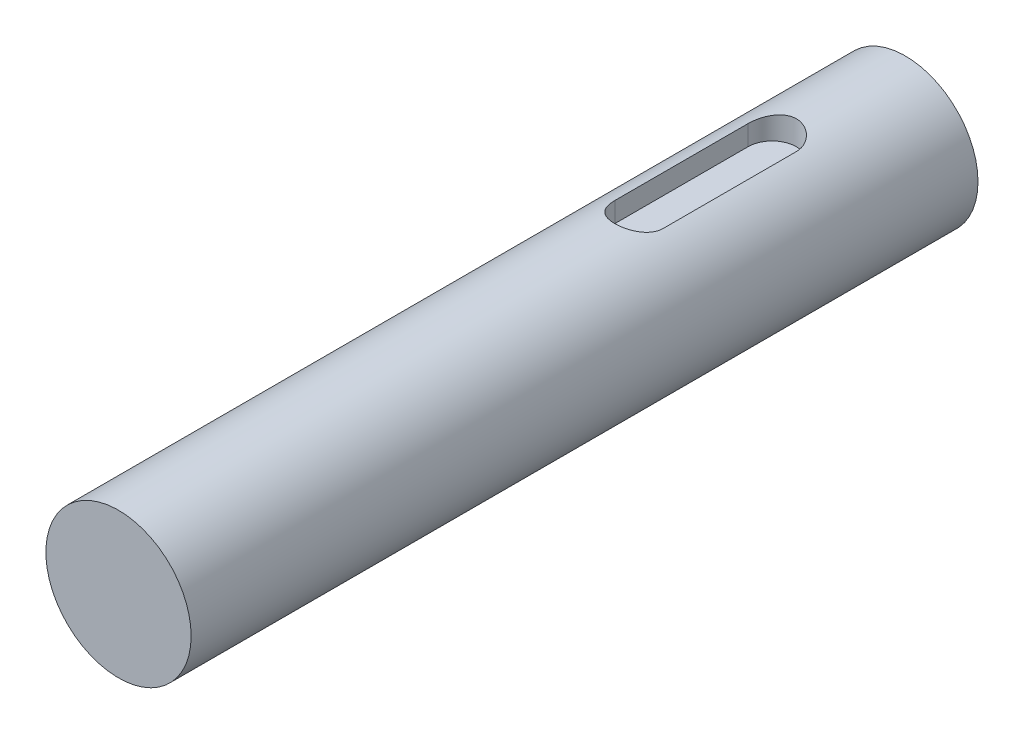
ISO-10303-21;
HEADER;
FILE_DESCRIPTION(('STEP AP214'),'2;1');
FILE_NAME('part.step','',(''),(''),'','','');
FILE_SCHEMA(('AUTOMOTIVE_DESIGN { 1 0 10303 214 1 1 1 1 }'));
ENDSEC;
DATA;
#1=APPLICATION_CONTEXT('core data for automotive mechanical design processes');
#2=APPLICATION_PROTOCOL_DEFINITION('international standard','automotive_design',2000,#1);
#3=PRODUCT_CONTEXT('',#1,'mechanical');
#4=PRODUCT('Part','Part','',(#3));
#5=PRODUCT_RELATED_PRODUCT_CATEGORY('part','',(#4));
#6=PRODUCT_DEFINITION_FORMATION('','',#4);
#7=PRODUCT_DEFINITION_CONTEXT('part definition',#1,'design');
#8=PRODUCT_DEFINITION('design','',#6,#7);
#9=PRODUCT_DEFINITION_SHAPE('','',#8);
#10=(LENGTH_UNIT() NAMED_UNIT(*) SI_UNIT(.MILLI.,.METRE.));
#11=(NAMED_UNIT(*) PLANE_ANGLE_UNIT() SI_UNIT($,.RADIAN.));
#12=(NAMED_UNIT(*) SI_UNIT($,.STERADIAN.) SOLID_ANGLE_UNIT());
#13=UNCERTAINTY_MEASURE_WITH_UNIT(LENGTH_MEASURE(1.E-05),#10,'distance_accuracy_value','');
#14=(GEOMETRIC_REPRESENTATION_CONTEXT(3) GLOBAL_UNCERTAINTY_ASSIGNED_CONTEXT((#13)) GLOBAL_UNIT_ASSIGNED_CONTEXT((#10,
#11,#12)) REPRESENTATION_CONTEXT('',''));
#15=CARTESIAN_POINT('',(0.,0.,0.));
#16=DIRECTION('',(0.,0.,1.));
#17=DIRECTION('',(1.,0.,0.));
#18=AXIS2_PLACEMENT_3D('',#15,#16,#17);
#19=CARTESIAN_POINT('',(0.,0.,-50.));
#20=DIRECTION('',(0.,0.,1.));
#21=DIRECTION('',(1.,0.,0.));
#22=AXIS2_PLACEMENT_3D('',#19,#20,#21);
#23=CYLINDRICAL_SURFACE('',#22,6.);
#24=CARTESIAN_POINT('',(-2.,5.65685424949238,-28.));
#25=CARTESIAN_POINT('',(-2.0000014949184,5.65684884188678,-27.9454190063978));
#26=CARTESIAN_POINT('',(-1.99776424917479,5.6576451988649,-27.8908658756213));
#27=CARTESIAN_POINT('',(-1.9888512140728,5.66078654578442,-27.7821828318902));
#28=CARTESIAN_POINT('',(-1.98217662286705,5.66313111768244,-27.7280528086806));
#29=CARTESIAN_POINT('',(-1.95562135046158,5.67238184449301,-27.5672157136097));
#30=CARTESIAN_POINT('',(-1.92920846605623,5.6815058499903,-27.461638307459));
#31=CARTESIAN_POINT('',(-1.85991682366086,5.70456149397718,-27.2567496151124));
#32=CARTESIAN_POINT('',(-1.81704715197507,5.71849047905858,-27.1574349062542));
#33=CARTESIAN_POINT('',(-1.71614645792974,5.74957574438921,-26.9673203319891));
#34=CARTESIAN_POINT('',(-1.65810612564547,5.76673400456216,-26.8765257418653));
#35=CARTESIAN_POINT('',(-1.52610278704603,5.80308960804095,-26.7025595373509));
#36=CARTESIAN_POINT('',(-1.45164996064407,5.82233755536618,-26.6197702390748));
#37=CARTESIAN_POINT('',(-1.28997688598297,5.86027697385955,-26.4675879644166));
#38=CARTESIAN_POINT('',(-1.20275436910907,5.87896834543705,-26.3981973734881));
#39=CARTESIAN_POINT('',(-1.01520729191253,5.91427765988454,-26.2730409623916));
#40=CARTESIAN_POINT('',(-0.914600178716995,5.93082875123708,-26.2176780311955));
#41=CARTESIAN_POINT('',(-0.704858499931719,5.95939217209316,-26.1248154966255));
#42=CARTESIAN_POINT('',(-0.595726551186841,5.97140588786619,-26.0873104363591));
#43=CARTESIAN_POINT('',(-0.376058690956075,5.98918142285845,-26.0325285478173));
#44=CARTESIAN_POINT('',(-0.265703668920225,5.99514617977147,-26.0145934548926));
#45=CARTESIAN_POINT('',(-0.0433979389113468,6.00087216807633,-25.9973674029488));
#46=CARTESIAN_POINT('',(0.0685523824907837,6.00063487762605,-25.9980720014605));
#47=CARTESIAN_POINT('',(0.286207690558783,5.99412077270532,-26.0176885662133));
#48=CARTESIAN_POINT('',(0.391985405251071,5.98808121982527,-26.0358852759189));
#49=CARTESIAN_POINT('',(0.598888128753311,5.97093921001647,-26.0887863973482));
#50=CARTESIAN_POINT('',(0.700012879232928,5.95983647235462,-26.1234917244125));
#51=CARTESIAN_POINT('',(0.896305246061924,5.93351336542608,-26.2088427392013));
#52=CARTESIAN_POINT('',(0.991377011307984,5.91824075676625,-26.2596920902447));
#53=CARTESIAN_POINT('',(1.17184917819498,5.88516775360088,-26.3757199027814));
#54=CARTESIAN_POINT('',(1.25724693942937,5.86736667195186,-26.440902262093));
#55=CARTESIAN_POINT('',(1.42019467942243,5.83012543885479,-26.5873420999937));
#56=CARTESIAN_POINT('',(1.4971872232254,5.81064757359828,-26.6692110872194));
#57=CARTESIAN_POINT('',(1.63654404964077,5.77294980945702,-26.8448829794323));
#58=CARTESIAN_POINT('',(1.69890360636763,5.75473031831506,-26.9386897248065));
#59=CARTESIAN_POINT('',(1.80800665118557,5.72140062752635,-27.1373603567066));
#60=CARTESIAN_POINT('',(1.85450601901537,5.70634029896469,-27.2423670298659));
#61=CARTESIAN_POINT('',(1.92892046140223,5.68162194124078,-27.4592939551799));
#62=CARTESIAN_POINT('',(1.95686487211071,5.67195538817985,-27.5712029867443));
#63=CARTESIAN_POINT('',(1.98331631256166,5.6627308418944,-27.736837273496));
#64=CARTESIAN_POINT('',(1.98957012251023,5.66053335389204,-27.7892827797085));
#65=CARTESIAN_POINT('',(1.99790923214239,5.65759407142798,-27.8944761567996));
#66=CARTESIAN_POINT('',(1.99999991078996,5.65685039859056,-27.9472235490888));
#67=CARTESIAN_POINT('',(2.,5.65685424949238,-28.));
#68=B_SPLINE_CURVE_WITH_KNOTS('',3,(#24,#25,#26,#27,#28,#29,#30,#31,#32,#33,#34,#35,#36,#37,#38,
#39,#40,#41,#42,#43,#44,#45,#46,#47,#48,#49,#50,#51,#52,#53,#54,#55,#56,#57,#58,#59,#60,#61,#62,
#63,#64,#65,#66,#67),.UNSPECIFIED.,.F.,.F.,(4,2,2,2,2,2,2,2,2,2,2,2,2,2,2,2,2,2,2,2,2,4),(0.,
0.163636969470864,0.327229772338922,0.653162396790745,0.978915321932474,1.30486862627062,
1.64233009925355,1.97985159727495,2.32618265866202,2.67240782242255,3.00658941454806,
3.34069136061285,3.6616883693147,3.98270317816496,4.30794037651935,4.63326613177537,
4.973881081161,5.31460588498485,5.6603605985608,6.00556734973678,6.16399790665503,
6.32222363058113),.UNSPECIFIED.);
#69=CARTESIAN_POINT('',(-2.,5.65685424949238,-28.));
#70=VERTEX_POINT('',#69);
#71=CARTESIAN_POINT('',(2.,5.65685424949238,-28.));
#72=VERTEX_POINT('',#71);
#73=EDGE_CURVE('E111',#70,#72,#68,.T.);
#74=ORIENTED_EDGE('',*,*,#73,.F.);
#75=DIRECTION('',(0.,0.,1.));
#76=VECTOR('',#75,1.);
#77=CARTESIAN_POINT('',(-2.,5.65685424949238,-50.));
#78=LINE('',#77,#76);
#79=CARTESIAN_POINT('',(-2.,5.65685424949238,-39.));
#80=VERTEX_POINT('',#79);
#81=EDGE_CURVE('E11',#80,#70,#78,.T.);
#82=ORIENTED_EDGE('',*,*,#81,.F.);
#83=CARTESIAN_POINT('',(2.,5.65685424949238,-39.));
#84=CARTESIAN_POINT('',(2.0000014949184,5.65684884188678,-39.0545809936022));
#85=CARTESIAN_POINT('',(1.99776424917478,5.6576451988649,-39.1091341243786));
#86=CARTESIAN_POINT('',(1.9888512140728,5.66078654578442,-39.2178171681098));
#87=CARTESIAN_POINT('',(1.98217662286705,5.66313111768244,-39.2719471913194));
#88=CARTESIAN_POINT('',(1.95562135046157,5.67238184449301,-39.4327842863903));
#89=CARTESIAN_POINT('',(1.92920846605622,5.6815058499903,-39.538361692541));
#90=CARTESIAN_POINT('',(1.85991682366085,5.70456149397718,-39.7432503848876));
#91=CARTESIAN_POINT('',(1.81704715197506,5.71849047905858,-39.8425650937458));
#92=CARTESIAN_POINT('',(1.71614645792973,5.74957574438921,-40.0326796680109));
#93=CARTESIAN_POINT('',(1.65810612564547,5.76673400456216,-40.1234742581347));
#94=CARTESIAN_POINT('',(1.52610278704602,5.80308960804095,-40.2974404626491));
#95=CARTESIAN_POINT('',(1.45164996064407,5.82233755536618,-40.3802297609252));
#96=CARTESIAN_POINT('',(1.28997688598296,5.86027697385956,-40.5324120355834));
#97=CARTESIAN_POINT('',(1.20275436910907,5.87896834543705,-40.6018026265119));
#98=CARTESIAN_POINT('',(1.01520729191252,5.91427765988454,-40.7269590376084));
#99=CARTESIAN_POINT('',(0.914600178716988,5.93082875123708,-40.7823219688045));
#100=CARTESIAN_POINT('',(0.704858499931712,5.95939217209317,-40.8751845033745));
#101=CARTESIAN_POINT('',(0.595726551186833,5.97140588786619,-40.9126895636409));
#102=CARTESIAN_POINT('',(0.376058690956067,5.98918142285845,-40.9674714521827));
#103=CARTESIAN_POINT('',(0.265703668920218,5.99514617977147,-40.9854065451074));
#104=CARTESIAN_POINT('',(0.0433979389113405,6.00087216807633,-41.0026325970512));
#105=CARTESIAN_POINT('',(-0.06855238249079,6.00063487762604,-41.0019279985395));
#106=CARTESIAN_POINT('',(-0.286207690558789,5.99412077270532,-40.9823114337867));
#107=CARTESIAN_POINT('',(-0.391985405251077,5.98808121982527,-40.9641147240811));
#108=CARTESIAN_POINT('',(-0.598888128753317,5.97093921001647,-40.9112136026517));
#109=CARTESIAN_POINT('',(-0.700012879232933,5.95983647235462,-40.8765082755875));
#110=CARTESIAN_POINT('',(-0.89630524606193,5.93351336542608,-40.7911572607987));
#111=CARTESIAN_POINT('',(-0.991377011307991,5.91824075676625,-40.7403079097553));
#112=CARTESIAN_POINT('',(-1.17184917819498,5.88516775360088,-40.6242800972186));
#113=CARTESIAN_POINT('',(-1.25724693942937,5.86736667195186,-40.559097737907));
#114=CARTESIAN_POINT('',(-1.42019467942243,5.83012543885479,-40.4126579000063));
#115=CARTESIAN_POINT('',(-1.4971872232254,5.81064757359828,-40.3307889127806));
#116=CARTESIAN_POINT('',(-1.63654404964077,5.77294980945702,-40.1551170205677));
#117=CARTESIAN_POINT('',(-1.69890360636763,5.75473031831506,-40.0613102751935));
#118=CARTESIAN_POINT('',(-1.80800665118557,5.72140062752635,-39.8626396432934));
#119=CARTESIAN_POINT('',(-1.85450601901537,5.70634029896469,-39.7576329701341));
#120=CARTESIAN_POINT('',(-1.92892046140224,5.68162194124078,-39.5407060448201));
#121=CARTESIAN_POINT('',(-1.95686487211072,5.67195538817985,-39.4287970132557));
#122=CARTESIAN_POINT('',(-1.98331631256166,5.6627308418944,-39.263162726504));
#123=CARTESIAN_POINT('',(-1.98957012251023,5.66053335389204,-39.2107172202915));
#124=CARTESIAN_POINT('',(-1.9979092321424,5.65759407142798,-39.1055238432004));
#125=CARTESIAN_POINT('',(-1.99999991078996,5.65685039859056,-39.0527764509112));
#126=CARTESIAN_POINT('',(-2.,5.65685424949238,-39.));
#127=B_SPLINE_CURVE_WITH_KNOTS('',3,(#83,#84,#85,#86,#87,#88,#89,#90,#91,#92,#93,#94,#95,#96,
#97,#98,#99,#100,#101,#102,#103,#104,#105,#106,#107,#108,#109,#110,#111,#112,#113,#114,#115,
#116,#117,#118,#119,#120,#121,#122,#123,#124,#125,#126),.UNSPECIFIED.,.F.,.F.,(4,2,2,2,2,2,2,2,
2,2,2,2,2,2,2,2,2,2,2,2,2,4),(0.,0.163636969470867,0.327229772338926,0.653162396790749,
0.978915321932481,1.30486862627063,1.64233009925356,1.97985159727495,2.32618265866203,
2.67240782242255,3.00658941454806,3.34069136061285,3.66168836931471,3.98270317816496,
4.30794037651936,4.63326613177538,4.97388108116101,5.31460588498485,5.6603605985608,
6.00556734973679,6.16399790665502,6.32222363058113),.UNSPECIFIED.);
#128=CARTESIAN_POINT('',(2.,5.65685424949238,-39.));
#129=VERTEX_POINT('',#128);
#130=EDGE_CURVE('E50',#129,#80,#127,.T.);
#131=ORIENTED_EDGE('',*,*,#130,.F.);
#132=DIRECTION('',(0.,0.,1.));
#133=VECTOR('',#132,1.);
#134=CARTESIAN_POINT('',(2.,5.65685424949238,-50.));
#135=LINE('',#134,#133);
#136=EDGE_CURVE('E122',#72,#129,#135,.F.);
#137=ORIENTED_EDGE('',*,*,#136,.F.);
#138=EDGE_LOOP('',(#74,#82,#131,#137));
#139=FACE_BOUND('',#138,.T.);
#140=CARTESIAN_POINT('',(0.,0.,-50.));
#141=DIRECTION('',(0.,0.,1.));
#142=DIRECTION('',(1.,0.,0.));
#143=AXIS2_PLACEMENT_3D('',#140,#141,#142);
#144=CIRCLE('',#143,6.);
#145=CARTESIAN_POINT('',(6.,0.,-50.));
#146=VERTEX_POINT('',#145);
#147=EDGE_CURVE('E110',#146,#146,#144,.T.);
#148=ORIENTED_EDGE('',*,*,#147,.T.);
#149=EDGE_LOOP('',(#148));
#150=FACE_BOUND('',#149,.T.);
#151=CARTESIAN_POINT('',(0.,0.,15.));
#152=DIRECTION('',(0.,0.,1.));
#153=DIRECTION('',(1.,0.,0.));
#154=AXIS2_PLACEMENT_3D('',#151,#152,#153);
#155=CIRCLE('',#154,6.);
#156=CARTESIAN_POINT('',(6.,0.,15.));
#157=VERTEX_POINT('',#156);
#158=EDGE_CURVE('E98',#157,#157,#155,.T.);
#159=ORIENTED_EDGE('',*,*,#158,.F.);
#160=EDGE_LOOP('',(#159));
#161=FACE_BOUND('',#160,.T.);
#162=ADVANCED_FACE('F39',(#139,#150,#161),#23,.T.);
#163=CARTESIAN_POINT('',(0.,0.,-50.));
#164=DIRECTION('',(0.,0.,1.));
#165=DIRECTION('',(1.,0.,0.));
#166=AXIS2_PLACEMENT_3D('',#163,#164,#165);
#167=PLANE('',#166);
#168=ORIENTED_EDGE('',*,*,#147,.F.);
#169=EDGE_LOOP('',(#168));
#170=FACE_BOUND('',#169,.T.);
#171=ADVANCED_FACE('F134',(#170),#167,.F.);
#172=CARTESIAN_POINT('',(0.,4.,-39.));
#173=DIRECTION('',(0.,1.,0.));
#174=DIRECTION('',(0.,0.,1.));
#175=AXIS2_PLACEMENT_3D('',#172,#173,#174);
#176=CYLINDRICAL_SURFACE('',#175,2.);
#177=DIRECTION('',(0.,1.,0.));
#178=VECTOR('',#177,1.);
#179=CARTESIAN_POINT('',(2.,4.,-39.));
#180=LINE('',#179,#178);
#181=CARTESIAN_POINT('',(2.,4.,-39.));
#182=VERTEX_POINT('',#181);
#183=EDGE_CURVE('E104',#182,#129,#180,.T.);
#184=ORIENTED_EDGE('',*,*,#183,.T.);
#185=ORIENTED_EDGE('',*,*,#130,.T.);
#186=DIRECTION('',(0.,1.,0.));
#187=VECTOR('',#186,1.);
#188=CARTESIAN_POINT('',(-2.,4.,-39.));
#189=LINE('',#188,#187);
#190=CARTESIAN_POINT('',(-2.,4.,-39.));
#191=VERTEX_POINT('',#190);
#192=EDGE_CURVE('E52',#191,#80,#189,.T.);
#193=ORIENTED_EDGE('',*,*,#192,.F.);
#194=CARTESIAN_POINT('',(0.,4.,-39.));
#195=DIRECTION('',(0.,1.,0.));
#196=DIRECTION('',(0.,0.,1.));
#197=AXIS2_PLACEMENT_3D('',#194,#195,#196);
#198=CIRCLE('',#197,2.);
#199=EDGE_CURVE('E85',#182,#191,#198,.T.);
#200=ORIENTED_EDGE('',*,*,#199,.F.);
#201=EDGE_LOOP('',(#184,#185,#193,#200));
#202=FACE_BOUND('',#201,.T.);
#203=ADVANCED_FACE('F77',(#202),#176,.F.);
#204=CARTESIAN_POINT('',(2.,4.,-39.));
#205=DIRECTION('',(1.,0.,0.));
#206=DIRECTION('',(0.,0.,-1.));
#207=AXIS2_PLACEMENT_3D('',#204,#205,#206);
#208=PLANE('',#207);
#209=ORIENTED_EDGE('',*,*,#136,.T.);
#210=ORIENTED_EDGE('',*,*,#183,.F.);
#211=DIRECTION('',(0.,0.,-1.));
#212=VECTOR('',#211,1.);
#213=CARTESIAN_POINT('',(2.,4.,-39.));
#214=LINE('',#213,#212);
#215=CARTESIAN_POINT('',(2.,4.,-28.));
#216=VERTEX_POINT('',#215);
#217=EDGE_CURVE('E83',#216,#182,#214,.T.);
#218=ORIENTED_EDGE('',*,*,#217,.F.);
#219=DIRECTION('',(0.,1.,0.));
#220=VECTOR('',#219,1.);
#221=CARTESIAN_POINT('',(2.,4.,-28.));
#222=LINE('',#221,#220);
#223=EDGE_CURVE('E107',#216,#72,#222,.T.);
#224=ORIENTED_EDGE('',*,*,#223,.T.);
#225=EDGE_LOOP('',(#209,#210,#218,#224));
#226=FACE_BOUND('',#225,.T.);
#227=ADVANCED_FACE('F130',(#226),#208,.F.);
#228=CARTESIAN_POINT('',(0.,4.,-28.));
#229=DIRECTION('',(0.,1.,0.));
#230=DIRECTION('',(0.,0.,1.));
#231=AXIS2_PLACEMENT_3D('',#228,#229,#230);
#232=CYLINDRICAL_SURFACE('',#231,2.);
#233=DIRECTION('',(0.,1.,0.));
#234=VECTOR('',#233,1.);
#235=CARTESIAN_POINT('',(-2.,4.,-28.));
#236=LINE('',#235,#234);
#237=CARTESIAN_POINT('',(-2.,4.,-28.));
#238=VERTEX_POINT('',#237);
#239=EDGE_CURVE('E81',#238,#70,#236,.T.);
#240=ORIENTED_EDGE('',*,*,#239,.T.);
#241=ORIENTED_EDGE('',*,*,#73,.T.);
#242=ORIENTED_EDGE('',*,*,#223,.F.);
#243=CARTESIAN_POINT('',(0.,4.,-28.));
#244=DIRECTION('',(0.,1.,0.));
#245=DIRECTION('',(0.,0.,1.));
#246=AXIS2_PLACEMENT_3D('',#243,#244,#245);
#247=CIRCLE('',#246,2.);
#248=EDGE_CURVE('E94',#238,#216,#247,.T.);
#249=ORIENTED_EDGE('',*,*,#248,.F.);
#250=EDGE_LOOP('',(#240,#241,#242,#249));
#251=FACE_BOUND('',#250,.T.);
#252=ADVANCED_FACE('F125',(#251),#232,.F.);
#253=CARTESIAN_POINT('',(-2.,4.,-39.));
#254=DIRECTION('',(-1.,0.,0.));
#255=DIRECTION('',(0.,0.,1.));
#256=AXIS2_PLACEMENT_3D('',#253,#254,#255);
#257=PLANE('',#256);
#258=ORIENTED_EDGE('',*,*,#81,.T.);
#259=ORIENTED_EDGE('',*,*,#239,.F.);
#260=DIRECTION('',(0.,0.,1.));
#261=VECTOR('',#260,1.);
#262=CARTESIAN_POINT('',(-2.,4.,-39.));
#263=LINE('',#262,#261);
#264=EDGE_CURVE('E86',#191,#238,#263,.T.);
#265=ORIENTED_EDGE('',*,*,#264,.F.);
#266=ORIENTED_EDGE('',*,*,#192,.T.);
#267=EDGE_LOOP('',(#258,#259,#265,#266));
#268=FACE_BOUND('',#267,.T.);
#269=ADVANCED_FACE('F90',(#268),#257,.F.);
#270=CARTESIAN_POINT('',(0.,4.,-39.));
#271=DIRECTION('',(0.,1.,0.));
#272=DIRECTION('',(0.,0.,1.));
#273=AXIS2_PLACEMENT_3D('',#270,#271,#272);
#274=PLANE('',#273);
#275=ORIENTED_EDGE('',*,*,#199,.T.);
#276=ORIENTED_EDGE('',*,*,#264,.T.);
#277=ORIENTED_EDGE('',*,*,#248,.T.);
#278=ORIENTED_EDGE('',*,*,#217,.T.);
#279=EDGE_LOOP('',(#275,#276,#277,#278));
#280=FACE_BOUND('',#279,.T.);
#281=ADVANCED_FACE('F96',(#280),#274,.T.);
#282=CARTESIAN_POINT('',(0.,0.,15.));
#283=DIRECTION('',(0.,0.,1.));
#284=DIRECTION('',(1.,0.,0.));
#285=AXIS2_PLACEMENT_3D('',#282,#283,#284);
#286=PLANE('',#285);
#287=ORIENTED_EDGE('',*,*,#158,.T.);
#288=EDGE_LOOP('',(#287));
#289=FACE_BOUND('',#288,.T.);
#290=ADVANCED_FACE('F148',(#289),#286,.T.);
#291=CLOSED_SHELL('',(#162,#171,#203,#227,#252,#269,#281,#290));
#292=MANIFOLD_SOLID_BREP('B2',#291);
#293=ADVANCED_BREP_SHAPE_REPRESENTATION('',(#18,#292),#14);
#294=SHAPE_DEFINITION_REPRESENTATION(#9,#293);
ENDSEC;
END-ISO-10303-21;
